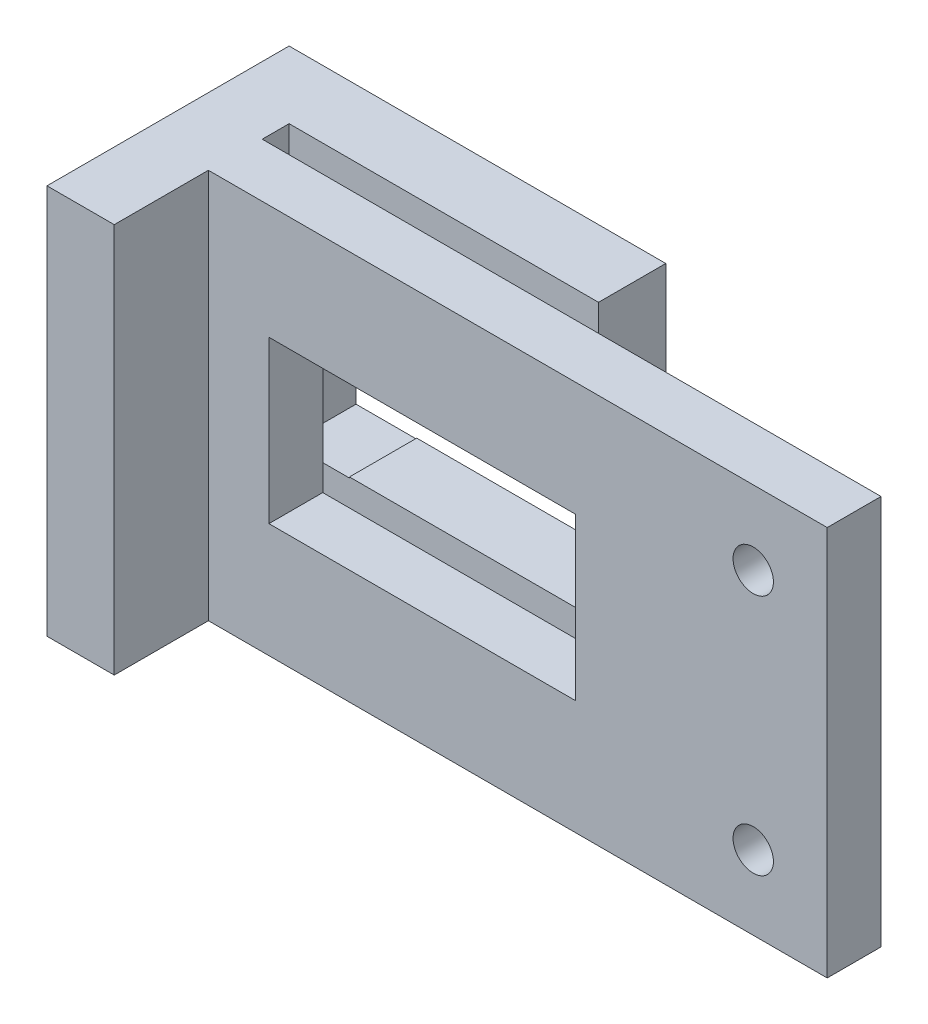
ISO-10303-21;
HEADER;
FILE_DESCRIPTION(('STEP AP214'),'2;1');
FILE_NAME('part.step','',(''),(''),'','','');
FILE_SCHEMA(('AUTOMOTIVE_DESIGN { 1 0 10303 214 1 1 1 1 }'));
ENDSEC;
DATA;
#1=APPLICATION_CONTEXT('core data for automotive mechanical design processes');
#2=APPLICATION_PROTOCOL_DEFINITION('international standard','automotive_design',2000,#1);
#3=PRODUCT_CONTEXT('',#1,'mechanical');
#4=PRODUCT('Part','Part','',(#3));
#5=PRODUCT_RELATED_PRODUCT_CATEGORY('part','',(#4));
#6=PRODUCT_DEFINITION_FORMATION('','',#4);
#7=PRODUCT_DEFINITION_CONTEXT('part definition',#1,'design');
#8=PRODUCT_DEFINITION('design','',#6,#7);
#9=PRODUCT_DEFINITION_SHAPE('','',#8);
#10=(LENGTH_UNIT() NAMED_UNIT(*) SI_UNIT(.MILLI.,.METRE.));
#11=(NAMED_UNIT(*) PLANE_ANGLE_UNIT() SI_UNIT($,.RADIAN.));
#12=(NAMED_UNIT(*) SI_UNIT($,.STERADIAN.) SOLID_ANGLE_UNIT());
#13=UNCERTAINTY_MEASURE_WITH_UNIT(LENGTH_MEASURE(1.E-05),#10,'distance_accuracy_value','');
#14=(GEOMETRIC_REPRESENTATION_CONTEXT(3) GLOBAL_UNCERTAINTY_ASSIGNED_CONTEXT((#13)) GLOBAL_UNIT_ASSIGNED_CONTEXT((#10,
#11,#12)) REPRESENTATION_CONTEXT('',''));
#15=CARTESIAN_POINT('',(0.,0.,0.));
#16=DIRECTION('',(0.,0.,1.));
#17=DIRECTION('',(1.,0.,0.));
#18=AXIS2_PLACEMENT_3D('',#15,#16,#17);
#19=CARTESIAN_POINT('',(0.,14.5,-2.));
#20=DIRECTION('',(0.,0.,1.));
#21=DIRECTION('',(1.,0.,0.));
#22=AXIS2_PLACEMENT_3D('',#19,#20,#21);
#23=PLANE('',#22);
#24=DIRECTION('',(0.,-1.,0.));
#25=VECTOR('',#24,1.);
#26=CARTESIAN_POINT('',(-20.225103609965,14.5,-2.));
#27=LINE('',#26,#25);
#28=CARTESIAN_POINT('',(-20.225103609965,5.99999999999999,-2.));
#29=VERTEX_POINT('',#28);
#30=CARTESIAN_POINT('',(-20.225103609965,5.97273767133536,-2.));
#31=VERTEX_POINT('',#30);
#32=EDGE_CURVE('E68',#29,#31,#27,.T.);
#33=ORIENTED_EDGE('',*,*,#32,.F.);
#34=DIRECTION('',(-1.,0.,0.));
#35=VECTOR('',#34,1.);
#36=CARTESIAN_POINT('',(0.,6.,-2.));
#37=LINE('',#36,#35);
#38=CARTESIAN_POINT('',(0.,5.99999999999999,-2.));
#39=VERTEX_POINT('',#38);
#40=EDGE_CURVE('E227',#39,#29,#37,.T.);
#41=ORIENTED_EDGE('',*,*,#40,.F.);
#42=DIRECTION('',(0.,1.,0.));
#43=VECTOR('',#42,1.);
#44=CARTESIAN_POINT('',(0.,14.5,-2.));
#45=LINE('',#44,#43);
#46=CARTESIAN_POINT('',(0.,14.5,-2.));
#47=VERTEX_POINT('',#46);
#48=EDGE_CURVE('E349',#39,#47,#45,.T.);
#49=ORIENTED_EDGE('',*,*,#48,.T.);
#50=DIRECTION('',(-1.,0.,0.));
#51=VECTOR('',#50,1.);
#52=CARTESIAN_POINT('',(0.,14.5,-2.));
#53=LINE('',#52,#51);
#54=CARTESIAN_POINT('',(-23.,14.5,-2.));
#55=VERTEX_POINT('',#54);
#56=EDGE_CURVE('E355',#47,#55,#53,.T.);
#57=ORIENTED_EDGE('',*,*,#56,.T.);
#58=DIRECTION('',(0.,1.,0.));
#59=VECTOR('',#58,1.);
#60=CARTESIAN_POINT('',(-23.,-14.5,-2.));
#61=LINE('',#60,#59);
#62=CARTESIAN_POINT('',(-23.,5.97273767133536,-2.));
#63=VERTEX_POINT('',#62);
#64=EDGE_CURVE('E359',#63,#55,#61,.T.);
#65=ORIENTED_EDGE('',*,*,#64,.F.);
#66=DIRECTION('',(-1.,0.,0.));
#67=VECTOR('',#66,1.);
#68=CARTESIAN_POINT('',(0.,5.97273767133536,-2.));
#69=LINE('',#68,#67);
#70=EDGE_CURVE('E250',#31,#63,#69,.T.);
#71=ORIENTED_EDGE('',*,*,#70,.F.);
#72=EDGE_LOOP('',(#33,#41,#49,#57,#65,#71));
#73=FACE_BOUND('',#72,.T.);
#74=ADVANCED_FACE('F45',(#73),#23,.T.);
#75=CARTESIAN_POINT('',(0.,0.,0.));
#76=DIRECTION('',(1.,0.,0.));
#77=DIRECTION('',(0.,0.,-1.));
#78=AXIS2_PLACEMENT_3D('',#75,#76,#77);
#79=PLANE('',#78);
#80=DIRECTION('',(0.,1.,0.));
#81=VECTOR('',#80,1.);
#82=CARTESIAN_POINT('',(0.,-45.5,-7.));
#83=LINE('',#82,#81);
#84=CARTESIAN_POINT('',(0.,5.99999999999999,-7.));
#85=VERTEX_POINT('',#84);
#86=CARTESIAN_POINT('',(0.,14.5,-7.));
#87=VERTEX_POINT('',#86);
#88=EDGE_CURVE('E214',#85,#87,#83,.T.);
#89=ORIENTED_EDGE('',*,*,#88,.T.);
#90=DIRECTION('',(0.,0.,-1.));
#91=VECTOR('',#90,1.);
#92=CARTESIAN_POINT('',(0.,14.5,-17.));
#93=LINE('',#92,#91);
#94=EDGE_CURVE('E341',#47,#87,#93,.T.);
#95=ORIENTED_EDGE('',*,*,#94,.F.);
#96=ORIENTED_EDGE('',*,*,#48,.F.);
#97=DIRECTION('',(0.,0.,1.));
#98=VECTOR('',#97,1.);
#99=CARTESIAN_POINT('',(0.,5.99999999999999,0.));
#100=LINE('',#99,#98);
#101=EDGE_CURVE('E440',#85,#39,#100,.T.);
#102=ORIENTED_EDGE('',*,*,#101,.F.);
#103=EDGE_LOOP('',(#89,#95,#96,#102));
#104=FACE_BOUND('',#103,.T.);
#105=ADVANCED_FACE('F532',(#104),#79,.T.);
#106=CARTESIAN_POINT('',(-23.,14.5,4.));
#107=DIRECTION('',(0.,-1.,0.));
#108=DIRECTION('',(1.,0.,0.));
#109=AXIS2_PLACEMENT_3D('',#106,#107,#108);
#110=PLANE('',#109);
#111=ORIENTED_EDGE('',*,*,#94,.T.);
#112=DIRECTION('',(1.,0.,0.));
#113=VECTOR('',#112,1.);
#114=CARTESIAN_POINT('',(-28.,14.5,-7.));
#115=LINE('',#114,#113);
#116=CARTESIAN_POINT('',(-28.,14.5,-7.));
#117=VERTEX_POINT('',#116);
#118=EDGE_CURVE('E273',#117,#87,#115,.T.);
#119=ORIENTED_EDGE('',*,*,#118,.F.);
#120=DIRECTION('',(0.,0.,1.));
#121=VECTOR('',#120,1.);
#122=CARTESIAN_POINT('',(-28.,14.5,-17.));
#123=LINE('',#122,#121);
#124=CARTESIAN_POINT('',(-28.,14.5,11.));
#125=VERTEX_POINT('',#124);
#126=EDGE_CURVE('E403',#117,#125,#123,.T.);
#127=ORIENTED_EDGE('',*,*,#126,.T.);
#128=DIRECTION('',(-1.,0.,0.));
#129=VECTOR('',#128,1.);
#130=CARTESIAN_POINT('',(-23.,14.5,11.));
#131=LINE('',#130,#129);
#132=CARTESIAN_POINT('',(-23.,14.5,11.));
#133=VERTEX_POINT('',#132);
#134=EDGE_CURVE('E372',#133,#125,#131,.T.);
#135=ORIENTED_EDGE('',*,*,#134,.F.);
#136=DIRECTION('',(0.,0.,-1.));
#137=VECTOR('',#136,1.);
#138=CARTESIAN_POINT('',(-23.,14.5,11.));
#139=LINE('',#138,#137);
#140=CARTESIAN_POINT('',(-23.,14.5,4.));
#141=VERTEX_POINT('',#140);
#142=EDGE_CURVE('E390',#133,#141,#139,.T.);
#143=ORIENTED_EDGE('',*,*,#142,.T.);
#144=DIRECTION('',(-1.,0.,0.));
#145=VECTOR('',#144,1.);
#146=CARTESIAN_POINT('',(-23.,14.5,4.));
#147=LINE('',#146,#145);
#148=CARTESIAN_POINT('',(23.,14.5,4.));
#149=VERTEX_POINT('',#148);
#150=EDGE_CURVE('E407',#149,#141,#147,.T.);
#151=ORIENTED_EDGE('',*,*,#150,.F.);
#152=DIRECTION('',(0.,0.,-1.));
#153=VECTOR('',#152,1.);
#154=CARTESIAN_POINT('',(23.,14.5,4.));
#155=LINE('',#154,#153);
#156=CARTESIAN_POINT('',(23.,14.5,0.));
#157=VERTEX_POINT('',#156);
#158=EDGE_CURVE('E417',#149,#157,#155,.T.);
#159=ORIENTED_EDGE('',*,*,#158,.T.);
#160=DIRECTION('',(-1.,0.,0.));
#161=VECTOR('',#160,1.);
#162=CARTESIAN_POINT('',(-23.,14.5,0.));
#163=LINE('',#162,#161);
#164=CARTESIAN_POINT('',(-23.,14.5,0.));
#165=VERTEX_POINT('',#164);
#166=EDGE_CURVE('E406',#157,#165,#163,.T.);
#167=ORIENTED_EDGE('',*,*,#166,.T.);
#168=DIRECTION('',(0.,0.,1.));
#169=VECTOR('',#168,1.);
#170=CARTESIAN_POINT('',(-23.,14.5,-17.));
#171=LINE('',#170,#169);
#172=EDGE_CURVE('E400',#55,#165,#171,.T.);
#173=ORIENTED_EDGE('',*,*,#172,.F.);
#174=ORIENTED_EDGE('',*,*,#56,.F.);
#175=EDGE_LOOP('',(#111,#119,#127,#135,#143,#151,#159,#167,#173,#174));
#176=FACE_BOUND('',#175,.T.);
#177=ADVANCED_FACE('F47',(#176),#110,.F.);
#178=CARTESIAN_POINT('',(-23.,-14.5,4.));
#179=DIRECTION('',(0.,1.,0.));
#180=DIRECTION('',(-1.,0.,0.));
#181=AXIS2_PLACEMENT_3D('',#178,#179,#180);
#182=PLANE('',#181);
#183=DIRECTION('',(0.,0.,1.));
#184=VECTOR('',#183,1.);
#185=CARTESIAN_POINT('',(-28.,-14.5,-17.));
#186=LINE('',#185,#184);
#187=CARTESIAN_POINT('',(-28.,-14.5,-7.));
#188=VERTEX_POINT('',#187);
#189=CARTESIAN_POINT('',(-28.,-14.5,11.));
#190=VERTEX_POINT('',#189);
#191=EDGE_CURVE('E394',#188,#190,#186,.T.);
#192=ORIENTED_EDGE('',*,*,#191,.F.);
#193=DIRECTION('',(1.,0.,0.));
#194=VECTOR('',#193,1.);
#195=CARTESIAN_POINT('',(-23.,-14.5,-7.));
#196=LINE('',#195,#194);
#197=CARTESIAN_POINT('',(0.,-14.5,-7.));
#198=VERTEX_POINT('',#197);
#199=EDGE_CURVE('E219',#188,#198,#196,.T.);
#200=ORIENTED_EDGE('',*,*,#199,.T.);
#201=DIRECTION('',(0.,0.,1.));
#202=VECTOR('',#201,1.);
#203=CARTESIAN_POINT('',(0.,-14.5,-17.));
#204=LINE('',#203,#202);
#205=CARTESIAN_POINT('',(0.,-14.5,-2.));
#206=VERTEX_POINT('',#205);
#207=EDGE_CURVE('E345',#198,#206,#204,.T.);
#208=ORIENTED_EDGE('',*,*,#207,.T.);
#209=DIRECTION('',(-1.,0.,0.));
#210=VECTOR('',#209,1.);
#211=CARTESIAN_POINT('',(0.,-14.5,-2.));
#212=LINE('',#211,#210);
#213=CARTESIAN_POINT('',(-23.,-14.5,-2.));
#214=VERTEX_POINT('',#213);
#215=EDGE_CURVE('E354',#206,#214,#212,.T.);
#216=ORIENTED_EDGE('',*,*,#215,.T.);
#217=DIRECTION('',(0.,0.,1.));
#218=VECTOR('',#217,1.);
#219=CARTESIAN_POINT('',(-23.,-14.5,-17.));
#220=LINE('',#219,#218);
#221=CARTESIAN_POINT('',(-23.,-14.5,0.));
#222=VERTEX_POINT('',#221);
#223=EDGE_CURVE('E397',#214,#222,#220,.T.);
#224=ORIENTED_EDGE('',*,*,#223,.T.);
#225=DIRECTION('',(1.,0.,0.));
#226=VECTOR('',#225,1.);
#227=CARTESIAN_POINT('',(-23.,-14.5,0.));
#228=LINE('',#227,#226);
#229=CARTESIAN_POINT('',(23.,-14.5,0.));
#230=VERTEX_POINT('',#229);
#231=EDGE_CURVE('E425',#222,#230,#228,.T.);
#232=ORIENTED_EDGE('',*,*,#231,.T.);
#233=DIRECTION('',(0.,0.,-1.));
#234=VECTOR('',#233,1.);
#235=CARTESIAN_POINT('',(23.,-14.5,4.));
#236=LINE('',#235,#234);
#237=CARTESIAN_POINT('',(23.,-14.5,4.));
#238=VERTEX_POINT('',#237);
#239=EDGE_CURVE('E433',#238,#230,#236,.T.);
#240=ORIENTED_EDGE('',*,*,#239,.F.);
#241=DIRECTION('',(1.,0.,0.));
#242=VECTOR('',#241,1.);
#243=CARTESIAN_POINT('',(-23.,-14.5,4.));
#244=LINE('',#243,#242);
#245=CARTESIAN_POINT('',(-23.,-14.5,4.));
#246=VERTEX_POINT('',#245);
#247=EDGE_CURVE('E410',#246,#238,#244,.T.);
#248=ORIENTED_EDGE('',*,*,#247,.F.);
#249=DIRECTION('',(0.,0.,-1.));
#250=VECTOR('',#249,1.);
#251=CARTESIAN_POINT('',(-23.,-14.5,11.));
#252=LINE('',#251,#250);
#253=CARTESIAN_POINT('',(-23.,-14.5,11.));
#254=VERTEX_POINT('',#253);
#255=EDGE_CURVE('E383',#254,#246,#252,.T.);
#256=ORIENTED_EDGE('',*,*,#255,.F.);
#257=DIRECTION('',(1.,0.,0.));
#258=VECTOR('',#257,1.);
#259=CARTESIAN_POINT('',(-23.,-14.5,11.));
#260=LINE('',#259,#258);
#261=EDGE_CURVE('E380',#190,#254,#260,.T.);
#262=ORIENTED_EDGE('',*,*,#261,.F.);
#263=EDGE_LOOP('',(#192,#200,#208,#216,#224,#232,#240,#248,#256,#262));
#264=FACE_BOUND('',#263,.T.);
#265=ADVANCED_FACE('F498',(#264),#182,.F.);
#266=CARTESIAN_POINT('',(23.,-14.5,4.));
#267=DIRECTION('',(-1.,0.,0.));
#268=DIRECTION('',(0.,0.,1.));
#269=AXIS2_PLACEMENT_3D('',#266,#267,#268);
#270=PLANE('',#269);
#271=DIRECTION('',(0.,1.,0.));
#272=VECTOR('',#271,1.);
#273=CARTESIAN_POINT('',(23.,-14.5,0.));
#274=LINE('',#273,#272);
#275=EDGE_CURVE('E411',#230,#157,#274,.T.);
#276=ORIENTED_EDGE('',*,*,#275,.T.);
#277=ORIENTED_EDGE('',*,*,#158,.F.);
#278=DIRECTION('',(0.,1.,0.));
#279=VECTOR('',#278,1.);
#280=CARTESIAN_POINT('',(23.,-14.5,4.));
#281=LINE('',#280,#279);
#282=EDGE_CURVE('E414',#238,#149,#281,.T.);
#283=ORIENTED_EDGE('',*,*,#282,.F.);
#284=ORIENTED_EDGE('',*,*,#239,.T.);
#285=EDGE_LOOP('',(#276,#277,#283,#284));
#286=FACE_BOUND('',#285,.T.);
#287=ADVANCED_FACE('F511',(#286),#270,.F.);
#288=CARTESIAN_POINT('',(0.,0.,4.));
#289=DIRECTION('',(0.,0.,1.));
#290=DIRECTION('',(1.,0.,0.));
#291=AXIS2_PLACEMENT_3D('',#288,#289,#290);
#292=PLANE('',#291);
#293=DIRECTION('',(-1.,0.,0.));
#294=VECTOR('',#293,1.);
#295=CARTESIAN_POINT('',(4.3,5.99999999999999,4.));
#296=LINE('',#295,#294);
#297=CARTESIAN_POINT('',(4.3,5.99999999999999,4.));
#298=VERTEX_POINT('',#297);
#299=CARTESIAN_POINT('',(-18.5,5.99999999999999,4.));
#300=VERTEX_POINT('',#299);
#301=EDGE_CURVE('E301',#298,#300,#296,.T.);
#302=ORIENTED_EDGE('',*,*,#301,.F.);
#303=DIRECTION('',(0.,1.,0.));
#304=VECTOR('',#303,1.);
#305=CARTESIAN_POINT('',(4.3,-6.00000000000001,4.));
#306=LINE('',#305,#304);
#307=CARTESIAN_POINT('',(4.3,-6.00000000000001,4.));
#308=VERTEX_POINT('',#307);
#309=EDGE_CURVE('E297',#308,#298,#306,.T.);
#310=ORIENTED_EDGE('',*,*,#309,.F.);
#311=DIRECTION('',(1.,0.,0.));
#312=VECTOR('',#311,1.);
#313=CARTESIAN_POINT('',(-18.5,-6.00000000000001,4.));
#314=LINE('',#313,#312);
#315=CARTESIAN_POINT('',(-18.5,-6.00000000000001,4.));
#316=VERTEX_POINT('',#315);
#317=EDGE_CURVE('E292',#316,#308,#314,.T.);
#318=ORIENTED_EDGE('',*,*,#317,.F.);
#319=DIRECTION('',(0.,-1.,0.));
#320=VECTOR('',#319,1.);
#321=CARTESIAN_POINT('',(-18.5,0.,4.));
#322=LINE('',#321,#320);
#323=EDGE_CURVE('E288',#300,#316,#322,.T.);
#324=ORIENTED_EDGE('',*,*,#323,.F.);
#325=EDGE_LOOP('',(#302,#310,#318,#324));
#326=FACE_BOUND('',#325,.T.);
#327=CARTESIAN_POINT('',(17.5,-8.99999999999999,4.));
#328=DIRECTION('',(0.,0.,1.));
#329=DIRECTION('',(1.,0.,0.));
#330=AXIS2_PLACEMENT_3D('',#327,#328,#329);
#331=CIRCLE('',#330,1.5);
#332=CARTESIAN_POINT('',(19.,-8.99999999999999,4.));
#333=VERTEX_POINT('',#332);
#334=EDGE_CURVE('E293',#333,#333,#331,.T.);
#335=ORIENTED_EDGE('',*,*,#334,.F.);
#336=EDGE_LOOP('',(#335));
#337=FACE_BOUND('',#336,.T.);
#338=CARTESIAN_POINT('',(17.5,9.,4.));
#339=DIRECTION('',(0.,0.,1.));
#340=DIRECTION('',(1.,0.,0.));
#341=AXIS2_PLACEMENT_3D('',#338,#339,#340);
#342=CIRCLE('',#341,1.5);
#343=CARTESIAN_POINT('',(19.,9.,4.));
#344=VERTEX_POINT('',#343);
#345=EDGE_CURVE('E287',#344,#344,#342,.T.);
#346=ORIENTED_EDGE('',*,*,#345,.F.);
#347=EDGE_LOOP('',(#346));
#348=FACE_BOUND('',#347,.T.);
#349=DIRECTION('',(0.,1.,0.));
#350=VECTOR('',#349,1.);
#351=CARTESIAN_POINT('',(-23.,14.5,4.));
#352=LINE('',#351,#350);
#353=EDGE_CURVE('E367',#246,#141,#352,.T.);
#354=ORIENTED_EDGE('',*,*,#353,.F.);
#355=ORIENTED_EDGE('',*,*,#247,.T.);
#356=ORIENTED_EDGE('',*,*,#282,.T.);
#357=ORIENTED_EDGE('',*,*,#150,.T.);
#358=EDGE_LOOP('',(#354,#355,#356,#357));
#359=FACE_BOUND('',#358,.T.);
#360=ADVANCED_FACE('F560',(#326,#337,#348,#359),#292,.T.);
#361=CARTESIAN_POINT('',(0.,0.,0.));
#362=DIRECTION('',(0.,0.,1.));
#363=DIRECTION('',(1.,0.,0.));
#364=AXIS2_PLACEMENT_3D('',#361,#362,#363);
#365=PLANE('',#364);
#366=DIRECTION('',(0.,1.,0.));
#367=VECTOR('',#366,1.);
#368=CARTESIAN_POINT('',(4.3,0.,0.));
#369=LINE('',#368,#367);
#370=CARTESIAN_POINT('',(4.3,-6.00000000000001,0.));
#371=VERTEX_POINT('',#370);
#372=CARTESIAN_POINT('',(4.3,5.99999999999999,0.));
#373=VERTEX_POINT('',#372);
#374=EDGE_CURVE('E443',#371,#373,#369,.T.);
#375=ORIENTED_EDGE('',*,*,#374,.T.);
#376=DIRECTION('',(-1.,0.,0.));
#377=VECTOR('',#376,1.);
#378=CARTESIAN_POINT('',(0.,5.99999999999999,0.));
#379=LINE('',#378,#377);
#380=CARTESIAN_POINT('',(-18.5,5.99999999999999,0.));
#381=VERTEX_POINT('',#380);
#382=EDGE_CURVE('E332',#373,#381,#379,.T.);
#383=ORIENTED_EDGE('',*,*,#382,.T.);
#384=DIRECTION('',(0.,-1.,0.));
#385=VECTOR('',#384,1.);
#386=CARTESIAN_POINT('',(-18.5,0.,0.));
#387=LINE('',#386,#385);
#388=CARTESIAN_POINT('',(-18.5,-6.00000000000001,0.));
#389=VERTEX_POINT('',#388);
#390=EDGE_CURVE('E336',#381,#389,#387,.T.);
#391=ORIENTED_EDGE('',*,*,#390,.T.);
#392=DIRECTION('',(1.,0.,0.));
#393=VECTOR('',#392,1.);
#394=CARTESIAN_POINT('',(0.,-6.00000000000001,0.));
#395=LINE('',#394,#393);
#396=EDGE_CURVE('E326',#389,#371,#395,.T.);
#397=ORIENTED_EDGE('',*,*,#396,.T.);
#398=EDGE_LOOP('',(#375,#383,#391,#397));
#399=FACE_BOUND('',#398,.T.);
#400=CARTESIAN_POINT('',(17.5,-8.99999999999999,0.));
#401=DIRECTION('',(0.,0.,1.));
#402=DIRECTION('',(1.,0.,0.));
#403=AXIS2_PLACEMENT_3D('',#400,#401,#402);
#404=CIRCLE('',#403,1.5);
#405=CARTESIAN_POINT('',(19.,-8.99999999999999,0.));
#406=VERTEX_POINT('',#405);
#407=EDGE_CURVE('E346',#406,#406,#404,.T.);
#408=ORIENTED_EDGE('',*,*,#407,.T.);
#409=EDGE_LOOP('',(#408));
#410=FACE_BOUND('',#409,.T.);
#411=CARTESIAN_POINT('',(17.5,9.,0.));
#412=DIRECTION('',(0.,0.,1.));
#413=DIRECTION('',(1.,0.,0.));
#414=AXIS2_PLACEMENT_3D('',#411,#412,#413);
#415=CIRCLE('',#414,1.5);
#416=CARTESIAN_POINT('',(19.,9.,0.));
#417=VERTEX_POINT('',#416);
#418=EDGE_CURVE('E340',#417,#417,#415,.T.);
#419=ORIENTED_EDGE('',*,*,#418,.T.);
#420=EDGE_LOOP('',(#419));
#421=FACE_BOUND('',#420,.T.);
#422=ORIENTED_EDGE('',*,*,#166,.F.);
#423=ORIENTED_EDGE('',*,*,#275,.F.);
#424=ORIENTED_EDGE('',*,*,#231,.F.);
#425=DIRECTION('',(0.,-1.,0.));
#426=VECTOR('',#425,1.);
#427=CARTESIAN_POINT('',(-23.,-14.5,0.));
#428=LINE('',#427,#426);
#429=EDGE_CURVE('E421',#165,#222,#428,.T.);
#430=ORIENTED_EDGE('',*,*,#429,.F.);
#431=EDGE_LOOP('',(#422,#423,#424,#430));
#432=FACE_BOUND('',#431,.T.);
#433=ADVANCED_FACE('F504',(#399,#410,#421,#432),#365,.F.);
#434=CARTESIAN_POINT('',(-23.,-14.5,-17.));
#435=DIRECTION('',(-1.,0.,0.));
#436=DIRECTION('',(0.,0.,1.));
#437=AXIS2_PLACEMENT_3D('',#434,#435,#436);
#438=PLANE('',#437);
#439=CARTESIAN_POINT('',(-23.,-6.07056539919997,-2.));
#440=VERTEX_POINT('',#439);
#441=EDGE_CURVE('E363',#214,#440,#61,.T.);
#442=ORIENTED_EDGE('',*,*,#441,.T.);
#443=DIRECTION('',(0.,0.,1.));
#444=VECTOR('',#443,1.);
#445=CARTESIAN_POINT('',(-23.,-6.07056539919997,-17.));
#446=LINE('',#445,#444);
#447=CARTESIAN_POINT('',(-23.,-6.07056539919997,-1.));
#448=VERTEX_POINT('',#447);
#449=EDGE_CURVE('E265',#440,#448,#446,.T.);
#450=ORIENTED_EDGE('',*,*,#449,.T.);
#451=DIRECTION('',(0.,-1.,0.));
#452=VECTOR('',#451,1.);
#453=CARTESIAN_POINT('',(-23.,-14.5,-1.));
#454=LINE('',#453,#452);
#455=CARTESIAN_POINT('',(-23.,5.97273767133536,-1.));
#456=VERTEX_POINT('',#455);
#457=EDGE_CURVE('E468',#456,#448,#454,.T.);
#458=ORIENTED_EDGE('',*,*,#457,.F.);
#459=DIRECTION('',(0.,0.,-1.));
#460=VECTOR('',#459,1.);
#461=CARTESIAN_POINT('',(-23.,5.97273767133536,-17.));
#462=LINE('',#461,#460);
#463=EDGE_CURVE('E258',#456,#63,#462,.T.);
#464=ORIENTED_EDGE('',*,*,#463,.T.);
#465=ORIENTED_EDGE('',*,*,#64,.T.);
#466=ORIENTED_EDGE('',*,*,#172,.T.);
#467=ORIENTED_EDGE('',*,*,#429,.T.);
#468=ORIENTED_EDGE('',*,*,#223,.F.);
#469=EDGE_LOOP('',(#442,#450,#458,#464,#465,#466,#467,#468));
#470=FACE_BOUND('',#469,.T.);
#471=ADVANCED_FACE('F500',(#470),#438,.F.);
#472=CARTESIAN_POINT('',(-28.,-14.5,-17.));
#473=DIRECTION('',(1.,0.,0.));
#474=DIRECTION('',(0.,0.,-1.));
#475=AXIS2_PLACEMENT_3D('',#472,#473,#474);
#476=PLANE('',#475);
#477=ORIENTED_EDGE('',*,*,#126,.F.);
#478=DIRECTION('',(0.,1.,0.));
#479=VECTOR('',#478,1.);
#480=CARTESIAN_POINT('',(-28.,-45.5,-7.));
#481=LINE('',#480,#479);
#482=EDGE_CURVE('E276',#188,#117,#481,.T.);
#483=ORIENTED_EDGE('',*,*,#482,.F.);
#484=ORIENTED_EDGE('',*,*,#191,.T.);
#485=DIRECTION('',(0.,-1.,0.));
#486=VECTOR('',#485,1.);
#487=CARTESIAN_POINT('',(-28.,14.5,11.));
#488=LINE('',#487,#486);
#489=EDGE_CURVE('E376',#125,#190,#488,.T.);
#490=ORIENTED_EDGE('',*,*,#489,.F.);
#491=EDGE_LOOP('',(#477,#483,#484,#490));
#492=FACE_BOUND('',#491,.T.);
#493=ADVANCED_FACE('F527',(#492),#476,.F.);
#494=CARTESIAN_POINT('',(-23.,14.5,11.));
#495=DIRECTION('',(-1.,0.,0.));
#496=DIRECTION('',(0.,0.,1.));
#497=AXIS2_PLACEMENT_3D('',#494,#495,#496);
#498=PLANE('',#497);
#499=ORIENTED_EDGE('',*,*,#353,.T.);
#500=ORIENTED_EDGE('',*,*,#142,.F.);
#501=DIRECTION('',(0.,1.,0.));
#502=VECTOR('',#501,1.);
#503=CARTESIAN_POINT('',(-23.,14.5,11.));
#504=LINE('',#503,#502);
#505=EDGE_CURVE('E368',#254,#133,#504,.T.);
#506=ORIENTED_EDGE('',*,*,#505,.F.);
#507=ORIENTED_EDGE('',*,*,#255,.T.);
#508=EDGE_LOOP('',(#499,#500,#506,#507));
#509=FACE_BOUND('',#508,.T.);
#510=ADVANCED_FACE('F519',(#509),#498,.F.);
#511=CARTESIAN_POINT('',(0.,0.,11.));
#512=DIRECTION('',(0.,0.,-1.));
#513=DIRECTION('',(-1.,0.,0.));
#514=AXIS2_PLACEMENT_3D('',#511,#512,#513);
#515=PLANE('',#514);
#516=ORIENTED_EDGE('',*,*,#505,.T.);
#517=ORIENTED_EDGE('',*,*,#134,.T.);
#518=ORIENTED_EDGE('',*,*,#489,.T.);
#519=ORIENTED_EDGE('',*,*,#261,.T.);
#520=EDGE_LOOP('',(#516,#517,#518,#519));
#521=FACE_BOUND('',#520,.T.);
#522=ADVANCED_FACE('F522',(#521),#515,.F.);
#523=DIRECTION('',(1.,0.,0.));
#524=VECTOR('',#523,1.);
#525=CARTESIAN_POINT('',(0.,-6.,-2.));
#526=LINE('',#525,#524);
#527=CARTESIAN_POINT('',(-18.5144821808709,-6.00000000000001,-2.));
#528=VERTEX_POINT('',#527);
#529=CARTESIAN_POINT('',(0.,-6.,-2.));
#530=VERTEX_POINT('',#529);
#531=EDGE_CURVE('E309',#528,#530,#526,.T.);
#532=ORIENTED_EDGE('',*,*,#531,.F.);
#533=DIRECTION('',(0.,1.,0.));
#534=VECTOR('',#533,1.);
#535=CARTESIAN_POINT('',(-18.5144821808709,14.5,-2.));
#536=LINE('',#535,#534);
#537=CARTESIAN_POINT('',(-18.5144821808709,-6.07056539919997,-2.));
#538=VERTEX_POINT('',#537);
#539=EDGE_CURVE('E269',#538,#528,#536,.T.);
#540=ORIENTED_EDGE('',*,*,#539,.F.);
#541=DIRECTION('',(1.,0.,0.));
#542=VECTOR('',#541,1.);
#543=CARTESIAN_POINT('',(0.,-6.07056539919997,-2.));
#544=LINE('',#543,#542);
#545=EDGE_CURVE('E262',#440,#538,#544,.T.);
#546=ORIENTED_EDGE('',*,*,#545,.F.);
#547=ORIENTED_EDGE('',*,*,#441,.F.);
#548=ORIENTED_EDGE('',*,*,#215,.F.);
#549=EDGE_CURVE('E350',#206,#530,#45,.T.);
#550=ORIENTED_EDGE('',*,*,#549,.T.);
#551=EDGE_LOOP('',(#532,#540,#546,#547,#548,#550));
#552=FACE_BOUND('',#551,.T.);
#553=ADVANCED_FACE('F492',(#552),#23,.T.);
#554=CARTESIAN_POINT('',(0.,-6.00000000000001,-7.));
#555=VERTEX_POINT('',#554);
#556=EDGE_CURVE('E279',#198,#555,#83,.T.);
#557=ORIENTED_EDGE('',*,*,#556,.T.);
#558=DIRECTION('',(0.,0.,-1.));
#559=VECTOR('',#558,1.);
#560=CARTESIAN_POINT('',(0.,-6.00000000000001,0.));
#561=LINE('',#560,#559);
#562=EDGE_CURVE('E437',#530,#555,#561,.T.);
#563=ORIENTED_EDGE('',*,*,#562,.F.);
#564=ORIENTED_EDGE('',*,*,#549,.F.);
#565=ORIENTED_EDGE('',*,*,#207,.F.);
#566=EDGE_LOOP('',(#557,#563,#564,#565));
#567=FACE_BOUND('',#566,.T.);
#568=ADVANCED_FACE('F487',(#567),#79,.T.);
#569=CARTESIAN_POINT('',(4.3,5.99999999999999,-24.));
#570=DIRECTION('',(0.,1.,0.));
#571=DIRECTION('',(0.,0.,1.));
#572=AXIS2_PLACEMENT_3D('',#569,#570,#571);
#573=PLANE('',#572);
#574=ORIENTED_EDGE('',*,*,#40,.T.);
#575=DIRECTION('',(0.,0.,1.));
#576=VECTOR('',#575,1.);
#577=CARTESIAN_POINT('',(-20.225103609965,5.99999999999999,-61.));
#578=LINE('',#577,#576);
#579=CARTESIAN_POINT('',(-20.225103609965,5.99999999999999,-7.));
#580=VERTEX_POINT('',#579);
#581=EDGE_CURVE('E222',#580,#29,#578,.T.);
#582=ORIENTED_EDGE('',*,*,#581,.F.);
#583=DIRECTION('',(1.,0.,0.));
#584=VECTOR('',#583,1.);
#585=CARTESIAN_POINT('',(4.3,5.99999999999999,-7.));
#586=LINE('',#585,#584);
#587=EDGE_CURVE('E208',#580,#85,#586,.T.);
#588=ORIENTED_EDGE('',*,*,#587,.T.);
#589=ORIENTED_EDGE('',*,*,#101,.T.);
#590=EDGE_LOOP('',(#574,#582,#588,#589));
#591=FACE_BOUND('',#590,.T.);
#592=ADVANCED_FACE('F225',(#591),#573,.F.);
#593=CARTESIAN_POINT('',(-18.5,-6.00000000000001,-24.));
#594=DIRECTION('',(0.,-1.,0.));
#595=DIRECTION('',(0.,0.,-1.));
#596=AXIS2_PLACEMENT_3D('',#593,#594,#595);
#597=PLANE('',#596);
#598=DIRECTION('',(-1.,0.,0.));
#599=VECTOR('',#598,1.);
#600=CARTESIAN_POINT('',(-18.5,-6.00000000000001,-7.));
#601=LINE('',#600,#599);
#602=CARTESIAN_POINT('',(-18.5144821808709,-6.00000000000001,-7.));
#603=VERTEX_POINT('',#602);
#604=EDGE_CURVE('E61',#555,#603,#601,.T.);
#605=ORIENTED_EDGE('',*,*,#604,.T.);
#606=DIRECTION('',(0.,0.,-1.));
#607=VECTOR('',#606,1.);
#608=CARTESIAN_POINT('',(-18.5144821808709,-6.00000000000001,-61.));
#609=LINE('',#608,#607);
#610=EDGE_CURVE('E11',#528,#603,#609,.T.);
#611=ORIENTED_EDGE('',*,*,#610,.F.);
#612=ORIENTED_EDGE('',*,*,#531,.T.);
#613=ORIENTED_EDGE('',*,*,#562,.T.);
#614=EDGE_LOOP('',(#605,#611,#612,#613));
#615=FACE_BOUND('',#614,.T.);
#616=ADVANCED_FACE('F489',(#615),#597,.F.);
#617=CARTESIAN_POINT('',(17.5,9.,-24.));
#618=DIRECTION('',(0.,0.,1.));
#619=DIRECTION('',(1.,0.,0.));
#620=AXIS2_PLACEMENT_3D('',#617,#618,#619);
#621=CYLINDRICAL_SURFACE('',#620,1.5);
#622=CARTESIAN_POINT('',(19.,9.,4.));
#623=CARTESIAN_POINT('',(19.,9.,3.95833333333333));
#624=CARTESIAN_POINT('',(19.,9.,3.91666666666666));
#625=CARTESIAN_POINT('',(19.,9.,3.83333333333333));
#626=CARTESIAN_POINT('',(19.,9.,3.79166666666666));
#627=CARTESIAN_POINT('',(19.,9.,3.70833333333333));
#628=CARTESIAN_POINT('',(19.,9.,3.66666666666666));
#629=CARTESIAN_POINT('',(19.,9.,3.58333333333333));
#630=CARTESIAN_POINT('',(19.,9.,3.54166666666666));
#631=CARTESIAN_POINT('',(19.,9.,3.45833333333333));
#632=CARTESIAN_POINT('',(19.,9.,3.41666666666666));
#633=CARTESIAN_POINT('',(19.,9.,3.33333333333333));
#634=CARTESIAN_POINT('',(19.,9.,3.29166666666666));
#635=CARTESIAN_POINT('',(19.,9.,3.20833333333333));
#636=CARTESIAN_POINT('',(19.,9.,3.16666666666666));
#637=CARTESIAN_POINT('',(19.,9.,3.08333333333333));
#638=CARTESIAN_POINT('',(19.,9.,3.04166666666666));
#639=CARTESIAN_POINT('',(19.,9.,2.95833333333333));
#640=CARTESIAN_POINT('',(19.,9.,2.91666666666666));
#641=CARTESIAN_POINT('',(19.,9.,2.83333333333333));
#642=CARTESIAN_POINT('',(19.,9.,2.79166666666667));
#643=CARTESIAN_POINT('',(19.,9.,2.70833333333333));
#644=CARTESIAN_POINT('',(19.,9.,2.66666666666667));
#645=CARTESIAN_POINT('',(19.,9.,2.58333333333333));
#646=CARTESIAN_POINT('',(19.,9.,2.54166666666667));
#647=CARTESIAN_POINT('',(19.,9.,2.45833333333333));
#648=CARTESIAN_POINT('',(19.,9.,2.41666666666667));
#649=CARTESIAN_POINT('',(19.,9.,2.33333333333333));
#650=CARTESIAN_POINT('',(19.,9.,2.29166666666667));
#651=CARTESIAN_POINT('',(19.,9.,2.20833333333333));
#652=CARTESIAN_POINT('',(19.,9.,2.16666666666667));
#653=CARTESIAN_POINT('',(19.,9.,2.08333333333333));
#654=CARTESIAN_POINT('',(19.,9.,2.04166666666667));
#655=CARTESIAN_POINT('',(19.,9.,1.95833333333333));
#656=CARTESIAN_POINT('',(19.,9.,1.91666666666666));
#657=CARTESIAN_POINT('',(19.,9.,1.83333333333333));
#658=CARTESIAN_POINT('',(19.,9.,1.79166666666666));
#659=CARTESIAN_POINT('',(19.,9.,1.70833333333333));
#660=CARTESIAN_POINT('',(19.,9.,1.66666666666666));
#661=CARTESIAN_POINT('',(19.,9.,1.58333333333333));
#662=CARTESIAN_POINT('',(19.,9.,1.54166666666666));
#663=CARTESIAN_POINT('',(19.,9.,1.45833333333333));
#664=CARTESIAN_POINT('',(19.,9.,1.41666666666666));
#665=CARTESIAN_POINT('',(19.,9.,1.33333333333333));
#666=CARTESIAN_POINT('',(19.,9.,1.29166666666666));
#667=CARTESIAN_POINT('',(19.,9.,1.20833333333333));
#668=CARTESIAN_POINT('',(19.,9.,1.16666666666667));
#669=CARTESIAN_POINT('',(19.,9.,1.08333333333333));
#670=CARTESIAN_POINT('',(19.,9.,1.04166666666667));
#671=CARTESIAN_POINT('',(19.,9.,0.958333333333334));
#672=CARTESIAN_POINT('',(19.,9.,0.916666666666668));
#673=CARTESIAN_POINT('',(19.,9.,0.833333333333334));
#674=CARTESIAN_POINT('',(19.,9.,0.791666666666667));
#675=CARTESIAN_POINT('',(19.,9.,0.708333333333334));
#676=CARTESIAN_POINT('',(19.,9.,0.666666666666667));
#677=CARTESIAN_POINT('',(19.,9.,0.583333333333334));
#678=CARTESIAN_POINT('',(19.,9.,0.541666666666667));
#679=CARTESIAN_POINT('',(19.,9.,0.458333333333334));
#680=CARTESIAN_POINT('',(19.,9.,0.416666666666667));
#681=CARTESIAN_POINT('',(19.,9.,0.333333333333334));
#682=CARTESIAN_POINT('',(19.,9.,0.291666666666667));
#683=CARTESIAN_POINT('',(19.,9.,0.208333333333334));
#684=CARTESIAN_POINT('',(19.,9.,0.166666666666667));
#685=CARTESIAN_POINT('',(19.,9.,0.0833333333333334));
#686=CARTESIAN_POINT('',(19.,9.,0.0416666666666667));
#687=CARTESIAN_POINT('',(19.,9.,0.));
#688=B_SPLINE_CURVE_WITH_KNOTS('',3,(#622,#623,#624,#625,#626,#627,#628,#629,#630,#631,#632,
#633,#634,#635,#636,#637,#638,#639,#640,#641,#642,#643,#644,#645,#646,#647,#648,#649,#650,#651,
#652,#653,#654,#655,#656,#657,#658,#659,#660,#661,#662,#663,#664,#665,#666,#667,#668,#669,#670,
#671,#672,#673,#674,#675,#676,#677,#678,#679,#680,#681,#682,#683,#684,#685,#686,#687),
.UNSPECIFIED.,.F.,.F.,(4,2,2,2,2,2,2,2,2,2,2,2,2,2,2,2,2,2,2,2,2,2,2,2,2,2,2,2,2,2,2,2,4),(0.,
0.125,0.25,0.375,0.5,0.625000000000001,0.750000000000001,0.875000000000001,1.,1.125,1.25,1.375,
1.5,1.625,1.75,1.875,2.,2.125,2.25,2.375,2.5,2.625,2.75,2.875,3.,3.125,3.25,3.375,3.5,3.625,
3.75,3.875,4.),.UNSPECIFIED.);
#689=EDGE_CURVE('BSEAM622',#344,#417,#688,.T.);
#690=ORIENTED_EDGE('',*,*,#345,.T.);
#691=ORIENTED_EDGE('',*,*,#418,.F.);
#692=ORIENTED_EDGE('',*,*,#689,.T.);
#693=ORIENTED_EDGE('',*,*,#689,.F.);
#694=EDGE_LOOP('',(#690,#692,#691,#693));
#695=FACE_BOUND('',#694,.T.);
#696=ADVANCED_FACE('F622',(#695),#621,.F.);
#697=CARTESIAN_POINT('',(17.5,-8.99999999999999,-24.));
#698=DIRECTION('',(0.,0.,1.));
#699=DIRECTION('',(1.,0.,0.));
#700=AXIS2_PLACEMENT_3D('',#697,#698,#699);
#701=CYLINDRICAL_SURFACE('',#700,1.5);
#702=CARTESIAN_POINT('',(19.,-8.99999999999999,4.));
#703=CARTESIAN_POINT('',(19.,-8.99999999999999,3.95833333333333));
#704=CARTESIAN_POINT('',(19.,-8.99999999999999,3.91666666666666));
#705=CARTESIAN_POINT('',(19.,-8.99999999999999,3.83333333333333));
#706=CARTESIAN_POINT('',(19.,-8.99999999999999,3.79166666666666));
#707=CARTESIAN_POINT('',(19.,-8.99999999999999,3.70833333333333));
#708=CARTESIAN_POINT('',(19.,-8.99999999999999,3.66666666666666));
#709=CARTESIAN_POINT('',(19.,-8.99999999999999,3.58333333333333));
#710=CARTESIAN_POINT('',(19.,-8.99999999999999,3.54166666666666));
#711=CARTESIAN_POINT('',(19.,-8.99999999999999,3.45833333333333));
#712=CARTESIAN_POINT('',(19.,-8.99999999999999,3.41666666666666));
#713=CARTESIAN_POINT('',(19.,-8.99999999999999,3.33333333333333));
#714=CARTESIAN_POINT('',(19.,-8.99999999999999,3.29166666666666));
#715=CARTESIAN_POINT('',(19.,-8.99999999999999,3.20833333333333));
#716=CARTESIAN_POINT('',(19.,-8.99999999999999,3.16666666666666));
#717=CARTESIAN_POINT('',(19.,-8.99999999999999,3.08333333333333));
#718=CARTESIAN_POINT('',(19.,-8.99999999999999,3.04166666666666));
#719=CARTESIAN_POINT('',(19.,-8.99999999999999,2.95833333333333));
#720=CARTESIAN_POINT('',(19.,-8.99999999999999,2.91666666666666));
#721=CARTESIAN_POINT('',(19.,-8.99999999999999,2.83333333333333));
#722=CARTESIAN_POINT('',(19.,-8.99999999999999,2.79166666666667));
#723=CARTESIAN_POINT('',(19.,-8.99999999999999,2.70833333333333));
#724=CARTESIAN_POINT('',(19.,-8.99999999999999,2.66666666666667));
#725=CARTESIAN_POINT('',(19.,-8.99999999999999,2.58333333333333));
#726=CARTESIAN_POINT('',(19.,-8.99999999999999,2.54166666666667));
#727=CARTESIAN_POINT('',(19.,-8.99999999999999,2.45833333333333));
#728=CARTESIAN_POINT('',(19.,-8.99999999999999,2.41666666666667));
#729=CARTESIAN_POINT('',(19.,-8.99999999999999,2.33333333333333));
#730=CARTESIAN_POINT('',(19.,-8.99999999999999,2.29166666666667));
#731=CARTESIAN_POINT('',(19.,-8.99999999999999,2.20833333333333));
#732=CARTESIAN_POINT('',(19.,-8.99999999999999,2.16666666666667));
#733=CARTESIAN_POINT('',(19.,-8.99999999999999,2.08333333333333));
#734=CARTESIAN_POINT('',(19.,-8.99999999999999,2.04166666666667));
#735=CARTESIAN_POINT('',(19.,-8.99999999999999,1.95833333333333));
#736=CARTESIAN_POINT('',(19.,-8.99999999999999,1.91666666666666));
#737=CARTESIAN_POINT('',(19.,-8.99999999999999,1.83333333333333));
#738=CARTESIAN_POINT('',(19.,-8.99999999999999,1.79166666666666));
#739=CARTESIAN_POINT('',(19.,-8.99999999999999,1.70833333333333));
#740=CARTESIAN_POINT('',(19.,-8.99999999999999,1.66666666666666));
#741=CARTESIAN_POINT('',(19.,-8.99999999999999,1.58333333333333));
#742=CARTESIAN_POINT('',(19.,-8.99999999999999,1.54166666666666));
#743=CARTESIAN_POINT('',(19.,-8.99999999999999,1.45833333333333));
#744=CARTESIAN_POINT('',(19.,-8.99999999999999,1.41666666666666));
#745=CARTESIAN_POINT('',(19.,-8.99999999999999,1.33333333333333));
#746=CARTESIAN_POINT('',(19.,-8.99999999999999,1.29166666666666));
#747=CARTESIAN_POINT('',(19.,-8.99999999999999,1.20833333333333));
#748=CARTESIAN_POINT('',(19.,-8.99999999999999,1.16666666666667));
#749=CARTESIAN_POINT('',(19.,-8.99999999999999,1.08333333333333));
#750=CARTESIAN_POINT('',(19.,-8.99999999999999,1.04166666666667));
#751=CARTESIAN_POINT('',(19.,-8.99999999999999,0.958333333333334));
#752=CARTESIAN_POINT('',(19.,-8.99999999999999,0.916666666666668));
#753=CARTESIAN_POINT('',(19.,-8.99999999999999,0.833333333333334));
#754=CARTESIAN_POINT('',(19.,-8.99999999999999,0.791666666666667));
#755=CARTESIAN_POINT('',(19.,-8.99999999999999,0.708333333333334));
#756=CARTESIAN_POINT('',(19.,-8.99999999999999,0.666666666666667));
#757=CARTESIAN_POINT('',(19.,-8.99999999999999,0.583333333333334));
#758=CARTESIAN_POINT('',(19.,-8.99999999999999,0.541666666666667));
#759=CARTESIAN_POINT('',(19.,-8.99999999999999,0.458333333333334));
#760=CARTESIAN_POINT('',(19.,-8.99999999999999,0.416666666666667));
#761=CARTESIAN_POINT('',(19.,-8.99999999999999,0.333333333333334));
#762=CARTESIAN_POINT('',(19.,-8.99999999999999,0.291666666666667));
#763=CARTESIAN_POINT('',(19.,-8.99999999999999,0.208333333333334));
#764=CARTESIAN_POINT('',(19.,-8.99999999999999,0.166666666666667));
#765=CARTESIAN_POINT('',(19.,-8.99999999999999,0.0833333333333334));
#766=CARTESIAN_POINT('',(19.,-8.99999999999999,0.0416666666666667));
#767=CARTESIAN_POINT('',(19.,-8.99999999999999,0.));
#768=B_SPLINE_CURVE_WITH_KNOTS('',3,(#702,#703,#704,#705,#706,#707,#708,#709,#710,#711,#712,
#713,#714,#715,#716,#717,#718,#719,#720,#721,#722,#723,#724,#725,#726,#727,#728,#729,#730,#731,
#732,#733,#734,#735,#736,#737,#738,#739,#740,#741,#742,#743,#744,#745,#746,#747,#748,#749,#750,
#751,#752,#753,#754,#755,#756,#757,#758,#759,#760,#761,#762,#763,#764,#765,#766,#767),
.UNSPECIFIED.,.F.,.F.,(4,2,2,2,2,2,2,2,2,2,2,2,2,2,2,2,2,2,2,2,2,2,2,2,2,2,2,2,2,2,2,2,4),(0.,
0.125,0.25,0.375,0.5,0.625000000000001,0.750000000000001,0.875000000000001,1.,1.125,1.25,1.375,
1.5,1.625,1.75,1.875,2.,2.125,2.25,2.375,2.5,2.625,2.75,2.875,3.,3.125,3.25,3.375,3.5,3.625,
3.75,3.875,4.),.UNSPECIFIED.);
#769=EDGE_CURVE('BSEAM626',#333,#406,#768,.T.);
#770=ORIENTED_EDGE('',*,*,#334,.T.);
#771=ORIENTED_EDGE('',*,*,#407,.F.);
#772=ORIENTED_EDGE('',*,*,#769,.T.);
#773=ORIENTED_EDGE('',*,*,#769,.F.);
#774=EDGE_LOOP('',(#770,#772,#771,#773));
#775=FACE_BOUND('',#774,.T.);
#776=ADVANCED_FACE('F626',(#775),#701,.F.);
#777=CARTESIAN_POINT('',(4.3,-6.00000000000001,-24.));
#778=DIRECTION('',(1.,0.,0.));
#779=DIRECTION('',(0.,0.,-1.));
#780=AXIS2_PLACEMENT_3D('',#777,#778,#779);
#781=PLANE('',#780);
#782=DIRECTION('',(0.,0.,1.));
#783=VECTOR('',#782,1.);
#784=CARTESIAN_POINT('',(4.3,-6.00000000000001,-24.));
#785=LINE('',#784,#783);
#786=EDGE_CURVE('E313',#371,#308,#785,.T.);
#787=ORIENTED_EDGE('',*,*,#786,.T.);
#788=ORIENTED_EDGE('',*,*,#309,.T.);
#789=DIRECTION('',(0.,0.,1.));
#790=VECTOR('',#789,1.);
#791=CARTESIAN_POINT('',(4.3,5.99999999999999,-24.));
#792=LINE('',#791,#790);
#793=EDGE_CURVE('E310',#373,#298,#792,.T.);
#794=ORIENTED_EDGE('',*,*,#793,.F.);
#795=ORIENTED_EDGE('',*,*,#374,.F.);
#796=EDGE_LOOP('',(#787,#788,#794,#795));
#797=FACE_BOUND('',#796,.T.);
#798=ADVANCED_FACE('F635',(#797),#781,.F.);
#799=CARTESIAN_POINT('',(-18.5,0.,-24.));
#800=DIRECTION('',(-1.,0.,0.));
#801=DIRECTION('',(0.,0.,1.));
#802=AXIS2_PLACEMENT_3D('',#799,#800,#801);
#803=PLANE('',#802);
#804=DIRECTION('',(0.,0.,1.));
#805=VECTOR('',#804,1.);
#806=CARTESIAN_POINT('',(-18.5,5.99999999999999,-24.));
#807=LINE('',#806,#805);
#808=EDGE_CURVE('E305',#381,#300,#807,.T.);
#809=ORIENTED_EDGE('',*,*,#808,.T.);
#810=ORIENTED_EDGE('',*,*,#323,.T.);
#811=DIRECTION('',(0.,0.,1.));
#812=VECTOR('',#811,1.);
#813=CARTESIAN_POINT('',(-18.5,-6.00000000000001,-24.));
#814=LINE('',#813,#812);
#815=EDGE_CURVE('E304',#389,#316,#814,.T.);
#816=ORIENTED_EDGE('',*,*,#815,.F.);
#817=ORIENTED_EDGE('',*,*,#390,.F.);
#818=EDGE_LOOP('',(#809,#810,#816,#817));
#819=FACE_BOUND('',#818,.T.);
#820=ADVANCED_FACE('F644',(#819),#803,.F.);
#821=ORIENTED_EDGE('',*,*,#793,.T.);
#822=ORIENTED_EDGE('',*,*,#301,.T.);
#823=ORIENTED_EDGE('',*,*,#808,.F.);
#824=ORIENTED_EDGE('',*,*,#382,.F.);
#825=EDGE_LOOP('',(#821,#822,#823,#824));
#826=FACE_BOUND('',#825,.T.);
#827=ADVANCED_FACE('F549',(#826),#573,.F.);
#828=ORIENTED_EDGE('',*,*,#815,.T.);
#829=ORIENTED_EDGE('',*,*,#317,.T.);
#830=ORIENTED_EDGE('',*,*,#786,.F.);
#831=ORIENTED_EDGE('',*,*,#396,.F.);
#832=EDGE_LOOP('',(#828,#829,#830,#831));
#833=FACE_BOUND('',#832,.T.);
#834=ADVANCED_FACE('F660',(#833),#597,.F.);
#835=CARTESIAN_POINT('',(-28.,-45.5,-7.));
#836=DIRECTION('',(0.,0.,1.));
#837=DIRECTION('',(1.,0.,0.));
#838=AXIS2_PLACEMENT_3D('',#835,#836,#837);
#839=PLANE('',#838);
#840=ORIENTED_EDGE('',*,*,#587,.F.);
#841=DIRECTION('',(0.,-1.,0.));
#842=VECTOR('',#841,1.);
#843=CARTESIAN_POINT('',(-20.225103609965,-45.5,-7.));
#844=LINE('',#843,#842);
#845=CARTESIAN_POINT('',(-20.225103609965,5.97273767133536,-7.));
#846=VERTEX_POINT('',#845);
#847=EDGE_CURVE('E211',#580,#846,#844,.T.);
#848=ORIENTED_EDGE('',*,*,#847,.T.);
#849=DIRECTION('',(-1.,0.,0.));
#850=VECTOR('',#849,1.);
#851=CARTESIAN_POINT('',(-28.,5.97273767133536,-7.));
#852=LINE('',#851,#850);
#853=CARTESIAN_POINT('',(-23.025117054876,5.97273767133536,-7.));
#854=VERTEX_POINT('',#853);
#855=EDGE_CURVE('E453',#846,#854,#852,.T.);
#856=ORIENTED_EDGE('',*,*,#855,.T.);
#857=DIRECTION('',(0.,-1.,0.));
#858=VECTOR('',#857,1.);
#859=CARTESIAN_POINT('',(-23.025117054876,-45.5,-7.));
#860=LINE('',#859,#858);
#861=CARTESIAN_POINT('',(-23.025117054876,-6.07056539919997,-7.));
#862=VERTEX_POINT('',#861);
#863=EDGE_CURVE('E456',#854,#862,#860,.T.);
#864=ORIENTED_EDGE('',*,*,#863,.T.);
#865=DIRECTION('',(1.,0.,0.));
#866=VECTOR('',#865,1.);
#867=CARTESIAN_POINT('',(-28.,-6.07056539919997,-7.));
#868=LINE('',#867,#866);
#869=CARTESIAN_POINT('',(-18.5144821808709,-6.07056539919997,-7.));
#870=VERTEX_POINT('',#869);
#871=EDGE_CURVE('E460',#862,#870,#868,.T.);
#872=ORIENTED_EDGE('',*,*,#871,.T.);
#873=DIRECTION('',(0.,1.,0.));
#874=VECTOR('',#873,1.);
#875=CARTESIAN_POINT('',(-18.5144821808709,-45.5,-7.));
#876=LINE('',#875,#874);
#877=EDGE_CURVE('E464',#870,#603,#876,.T.);
#878=ORIENTED_EDGE('',*,*,#877,.T.);
#879=ORIENTED_EDGE('',*,*,#604,.F.);
#880=ORIENTED_EDGE('',*,*,#556,.F.);
#881=ORIENTED_EDGE('',*,*,#199,.F.);
#882=ORIENTED_EDGE('',*,*,#482,.T.);
#883=ORIENTED_EDGE('',*,*,#118,.T.);
#884=ORIENTED_EDGE('',*,*,#88,.F.);
#885=EDGE_LOOP('',(#840,#848,#856,#864,#872,#878,#879,#880,#881,#882,#883,#884));
#886=FACE_BOUND('',#885,.T.);
#887=ADVANCED_FACE('F210',(#886),#839,.F.);
#888=CARTESIAN_POINT('',(0.,0.,-1.));
#889=DIRECTION('',(0.,0.,-1.));
#890=DIRECTION('',(-1.,0.,0.));
#891=AXIS2_PLACEMENT_3D('',#888,#889,#890);
#892=PLANE('',#891);
#893=ORIENTED_EDGE('',*,*,#457,.T.);
#894=DIRECTION('',(1.,0.,0.));
#895=VECTOR('',#894,1.);
#896=CARTESIAN_POINT('',(-18.5144821808709,-6.07056539919997,-1.));
#897=LINE('',#896,#895);
#898=CARTESIAN_POINT('',(-23.025117054876,-6.07056539919997,-1.));
#899=VERTEX_POINT('',#898);
#900=EDGE_CURVE('E241',#899,#448,#897,.T.);
#901=ORIENTED_EDGE('',*,*,#900,.F.);
#902=DIRECTION('',(0.,-1.,0.));
#903=VECTOR('',#902,1.);
#904=CARTESIAN_POINT('',(-23.025117054876,5.97273767133536,-1.));
#905=LINE('',#904,#903);
#906=CARTESIAN_POINT('',(-23.025117054876,5.97273767133536,-1.));
#907=VERTEX_POINT('',#906);
#908=EDGE_CURVE('E237',#907,#899,#905,.T.);
#909=ORIENTED_EDGE('',*,*,#908,.F.);
#910=DIRECTION('',(-1.,0.,0.));
#911=VECTOR('',#910,1.);
#912=CARTESIAN_POINT('',(-18.5144821808709,5.97273767133536,-1.));
#913=LINE('',#912,#911);
#914=EDGE_CURVE('E233',#456,#907,#913,.T.);
#915=ORIENTED_EDGE('',*,*,#914,.F.);
#916=EDGE_LOOP('',(#893,#901,#909,#915));
#917=FACE_BOUND('',#916,.T.);
#918=ADVANCED_FACE('F679',(#917),#892,.T.);
#919=CARTESIAN_POINT('',(-18.5144821808709,5.97273767133536,-61.));
#920=DIRECTION('',(1.,0.,0.));
#921=DIRECTION('',(0.,0.,-1.));
#922=AXIS2_PLACEMENT_3D('',#919,#920,#921);
#923=PLANE('',#922);
#924=ORIENTED_EDGE('',*,*,#539,.T.);
#925=ORIENTED_EDGE('',*,*,#610,.T.);
#926=ORIENTED_EDGE('',*,*,#877,.F.);
#927=DIRECTION('',(0.,0.,1.));
#928=VECTOR('',#927,1.);
#929=CARTESIAN_POINT('',(-18.5144821808709,-6.07056539919997,-61.));
#930=LINE('',#929,#928);
#931=EDGE_CURVE('E246',#870,#538,#930,.T.);
#932=ORIENTED_EDGE('',*,*,#931,.T.);
#933=EDGE_LOOP('',(#924,#925,#926,#932));
#934=FACE_BOUND('',#933,.T.);
#935=ADVANCED_FACE('F690',(#934),#923,.F.);
#936=CARTESIAN_POINT('',(-18.5144821808709,-6.07056539919997,-61.));
#937=DIRECTION('',(0.,-1.,0.));
#938=DIRECTION('',(0.,0.,-1.));
#939=AXIS2_PLACEMENT_3D('',#936,#937,#938);
#940=PLANE('',#939);
#941=ORIENTED_EDGE('',*,*,#545,.T.);
#942=ORIENTED_EDGE('',*,*,#931,.F.);
#943=ORIENTED_EDGE('',*,*,#871,.F.);
#944=DIRECTION('',(0.,0.,1.));
#945=VECTOR('',#944,1.);
#946=CARTESIAN_POINT('',(-23.025117054876,-6.07056539919997,-61.));
#947=LINE('',#946,#945);
#948=EDGE_CURVE('E251',#862,#899,#947,.T.);
#949=ORIENTED_EDGE('',*,*,#948,.T.);
#950=ORIENTED_EDGE('',*,*,#900,.T.);
#951=ORIENTED_EDGE('',*,*,#449,.F.);
#952=EDGE_LOOP('',(#941,#942,#943,#949,#950,#951));
#953=FACE_BOUND('',#952,.T.);
#954=ADVANCED_FACE('F700',(#953),#940,.F.);
#955=CARTESIAN_POINT('',(-23.025117054876,5.97273767133536,-61.));
#956=DIRECTION('',(-1.,0.,0.));
#957=DIRECTION('',(0.,0.,1.));
#958=AXIS2_PLACEMENT_3D('',#955,#956,#957);
#959=PLANE('',#958);
#960=DIRECTION('',(0.,0.,1.));
#961=VECTOR('',#960,1.);
#962=CARTESIAN_POINT('',(-23.025117054876,5.97273767133536,-61.));
#963=LINE('',#962,#961);
#964=EDGE_CURVE('E245',#854,#907,#963,.T.);
#965=ORIENTED_EDGE('',*,*,#964,.T.);
#966=ORIENTED_EDGE('',*,*,#908,.T.);
#967=ORIENTED_EDGE('',*,*,#948,.F.);
#968=ORIENTED_EDGE('',*,*,#863,.F.);
#969=EDGE_LOOP('',(#965,#966,#967,#968));
#970=FACE_BOUND('',#969,.T.);
#971=ADVANCED_FACE('F710',(#970),#959,.F.);
#972=CARTESIAN_POINT('',(-18.5144821808709,5.97273767133536,-61.));
#973=DIRECTION('',(0.,1.,0.));
#974=DIRECTION('',(0.,0.,1.));
#975=AXIS2_PLACEMENT_3D('',#972,#973,#974);
#976=PLANE('',#975);
#977=ORIENTED_EDGE('',*,*,#855,.F.);
#978=DIRECTION('',(0.,0.,1.));
#979=VECTOR('',#978,1.);
#980=CARTESIAN_POINT('',(-20.225103609965,5.97273767133536,-61.));
#981=LINE('',#980,#979);
#982=EDGE_CURVE('E54',#846,#31,#981,.T.);
#983=ORIENTED_EDGE('',*,*,#982,.T.);
#984=ORIENTED_EDGE('',*,*,#70,.T.);
#985=ORIENTED_EDGE('',*,*,#463,.F.);
#986=ORIENTED_EDGE('',*,*,#914,.T.);
#987=ORIENTED_EDGE('',*,*,#964,.F.);
#988=EDGE_LOOP('',(#977,#983,#984,#985,#986,#987));
#989=FACE_BOUND('',#988,.T.);
#990=ADVANCED_FACE('F473',(#989),#976,.F.);
#991=CARTESIAN_POINT('',(-20.225103609965,-6.00000000000001,-61.));
#992=DIRECTION('',(-1.,0.,0.));
#993=DIRECTION('',(0.,0.,1.));
#994=AXIS2_PLACEMENT_3D('',#991,#992,#993);
#995=PLANE('',#994);
#996=ORIENTED_EDGE('',*,*,#32,.T.);
#997=ORIENTED_EDGE('',*,*,#982,.F.);
#998=ORIENTED_EDGE('',*,*,#847,.F.);
#999=ORIENTED_EDGE('',*,*,#581,.T.);
#1000=EDGE_LOOP('',(#996,#997,#998,#999));
#1001=FACE_BOUND('',#1000,.T.);
#1002=ADVANCED_FACE('F221',(#1001),#995,.F.);
#1003=CLOSED_SHELL('',(#74,#105,#177,#265,#287,#360,#433,#471,#493,#510,#522,#553,#568,#592,
#616,#696,#776,#798,#820,#827,#834,#887,#918,#935,#954,#971,#990,#1002));
#1004=MANIFOLD_SOLID_BREP('B2',#1003);
#1005=ADVANCED_BREP_SHAPE_REPRESENTATION('',(#18,#1004),#14);
#1006=SHAPE_DEFINITION_REPRESENTATION(#9,#1005);
ENDSEC;
END-ISO-10303-21;
